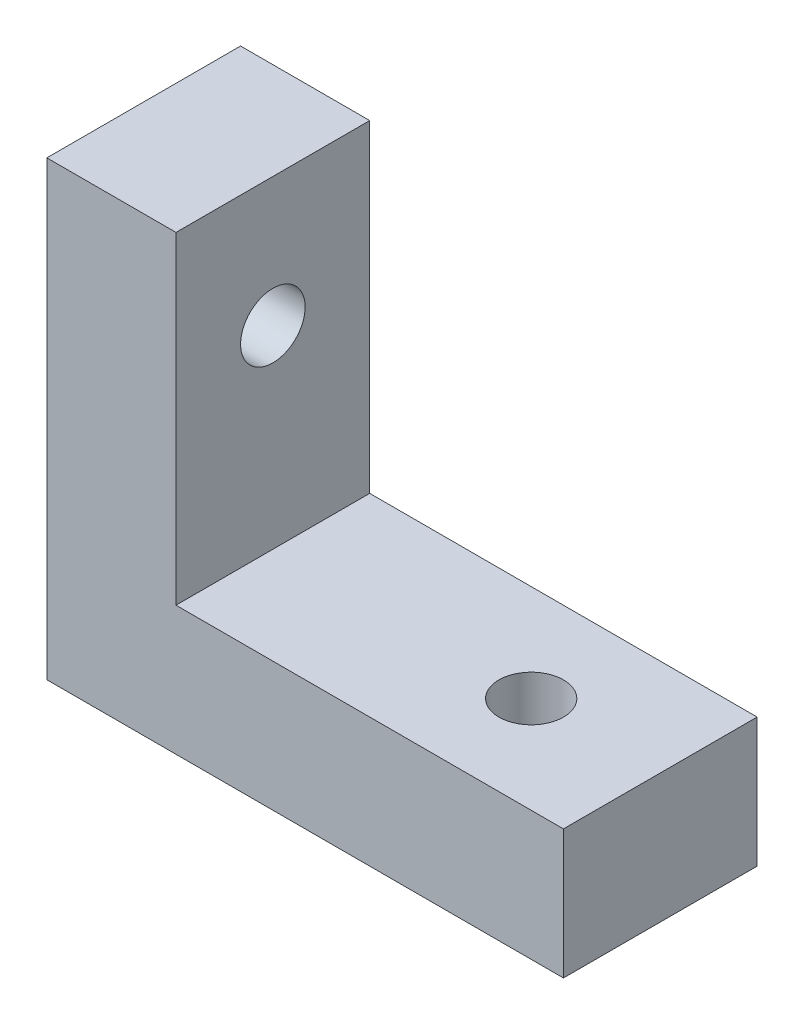
ISO-10303-21;
HEADER;
FILE_DESCRIPTION(('STEP AP214'),'2;1');
FILE_NAME('part.step','',(''),(''),'','','');
FILE_SCHEMA(('AUTOMOTIVE_DESIGN { 1 0 10303 214 1 1 1 1 }'));
ENDSEC;
DATA;
#1=APPLICATION_CONTEXT('core data for automotive mechanical design processes');
#2=APPLICATION_PROTOCOL_DEFINITION('international standard','automotive_design',2000,#1);
#3=PRODUCT_CONTEXT('',#1,'mechanical');
#4=PRODUCT('Part','Part','',(#3));
#5=PRODUCT_RELATED_PRODUCT_CATEGORY('part','',(#4));
#6=PRODUCT_DEFINITION_FORMATION('','',#4);
#7=PRODUCT_DEFINITION_CONTEXT('part definition',#1,'design');
#8=PRODUCT_DEFINITION('design','',#6,#7);
#9=PRODUCT_DEFINITION_SHAPE('','',#8);
#10=(LENGTH_UNIT() NAMED_UNIT(*) SI_UNIT(.MILLI.,.METRE.));
#11=(NAMED_UNIT(*) PLANE_ANGLE_UNIT() SI_UNIT($,.RADIAN.));
#12=(NAMED_UNIT(*) SI_UNIT($,.STERADIAN.) SOLID_ANGLE_UNIT());
#13=UNCERTAINTY_MEASURE_WITH_UNIT(LENGTH_MEASURE(1.E-05),#10,'distance_accuracy_value','');
#14=(GEOMETRIC_REPRESENTATION_CONTEXT(3) GLOBAL_UNCERTAINTY_ASSIGNED_CONTEXT((#13)) GLOBAL_UNIT_ASSIGNED_CONTEXT((#10,
#11,#12)) REPRESENTATION_CONTEXT('',''));
#15=CARTESIAN_POINT('',(0.,0.,0.));
#16=DIRECTION('',(0.,0.,1.));
#17=DIRECTION('',(1.,0.,0.));
#18=AXIS2_PLACEMENT_3D('',#15,#16,#17);
#19=CARTESIAN_POINT('',(0.,20.,0.));
#20=DIRECTION('',(0.,1.,0.));
#21=DIRECTION('',(0.,0.,1.));
#22=AXIS2_PLACEMENT_3D('',#19,#20,#21);
#23=PLANE('',#22);
#24=CARTESIAN_POINT('',(60.0181822973605,20.,-14.9932073778095));
#25=DIRECTION('',(0.,1.,0.));
#26=DIRECTION('',(0.,0.,1.));
#27=AXIS2_PLACEMENT_3D('',#24,#25,#26);
#28=CIRCLE('',#27,5.);
#29=CARTESIAN_POINT('',(60.0181822973605,20.,-9.9932073778095));
#30=VERTEX_POINT('',#29);
#31=EDGE_CURVE('E249',#30,#30,#28,.T.);
#32=ORIENTED_EDGE('',*,*,#31,.F.);
#33=EDGE_LOOP('',(#32));
#34=FACE_BOUND('',#33,.T.);
#35=DIRECTION('',(-1.,0.,0.));
#36=VECTOR('',#35,1.);
#37=CARTESIAN_POINT('',(80.,20.,-30.));
#38=LINE('',#37,#36);
#39=CARTESIAN_POINT('',(80.,20.,-30.));
#40=VERTEX_POINT('',#39);
#41=CARTESIAN_POINT('',(20.,20.,-30.));
#42=VERTEX_POINT('',#41);
#43=EDGE_CURVE('E109',#40,#42,#38,.T.);
#44=ORIENTED_EDGE('',*,*,#43,.T.);
#45=DIRECTION('',(0.,0.,1.));
#46=VECTOR('',#45,1.);
#47=CARTESIAN_POINT('',(20.,20.,-30.));
#48=LINE('',#47,#46);
#49=CARTESIAN_POINT('',(20.,20.,0.));
#50=VERTEX_POINT('',#49);
#51=EDGE_CURVE('E154',#42,#50,#48,.T.);
#52=ORIENTED_EDGE('',*,*,#51,.T.);
#53=DIRECTION('',(1.,0.,0.));
#54=VECTOR('',#53,1.);
#55=CARTESIAN_POINT('',(0.,20.,0.));
#56=LINE('',#55,#54);
#57=CARTESIAN_POINT('',(80.,20.,0.));
#58=VERTEX_POINT('',#57);
#59=EDGE_CURVE('E98',#50,#58,#56,.T.);
#60=ORIENTED_EDGE('',*,*,#59,.T.);
#61=DIRECTION('',(0.,0.,-1.));
#62=VECTOR('',#61,1.);
#63=CARTESIAN_POINT('',(80.,20.,0.));
#64=LINE('',#63,#62);
#65=EDGE_CURVE('E65',#58,#40,#64,.T.);
#66=ORIENTED_EDGE('',*,*,#65,.T.);
#67=EDGE_LOOP('',(#44,#52,#60,#66));
#68=FACE_BOUND('',#67,.T.);
#69=ADVANCED_FACE('F39',(#34,#68),#23,.T.);
#70=CARTESIAN_POINT('',(0.,20.,-30.));
#71=DIRECTION('',(1.,0.,0.));
#72=DIRECTION('',(0.,0.,-1.));
#73=AXIS2_PLACEMENT_3D('',#70,#71,#72);
#74=PLANE('',#73);
#75=CARTESIAN_POINT('',(0.,50.,-15.));
#76=DIRECTION('',(1.,0.,0.));
#77=DIRECTION('',(0.,0.,-1.));
#78=AXIS2_PLACEMENT_3D('',#75,#76,#77);
#79=CIRCLE('',#78,5.);
#80=CARTESIAN_POINT('',(0.,50.,-20.));
#81=VERTEX_POINT('',#80);
#82=EDGE_CURVE('E247',#81,#81,#79,.T.);
#83=ORIENTED_EDGE('',*,*,#82,.T.);
#84=EDGE_LOOP('',(#83));
#85=FACE_BOUND('',#84,.T.);
#86=DIRECTION('',(0.,0.,1.));
#87=VECTOR('',#86,1.);
#88=CARTESIAN_POINT('',(0.,0.,-30.));
#89=LINE('',#88,#87);
#90=CARTESIAN_POINT('',(0.,0.,-30.));
#91=VERTEX_POINT('',#90);
#92=CARTESIAN_POINT('',(0.,0.,0.));
#93=VERTEX_POINT('',#92);
#94=EDGE_CURVE('E104',#91,#93,#89,.T.);
#95=ORIENTED_EDGE('',*,*,#94,.T.);
#96=DIRECTION('',(0.,-1.,0.));
#97=VECTOR('',#96,1.);
#98=CARTESIAN_POINT('',(0.,20.,0.));
#99=LINE('',#98,#97);
#100=CARTESIAN_POINT('',(0.,70.,0.));
#101=VERTEX_POINT('',#100);
#102=EDGE_CURVE('E11',#101,#93,#99,.T.);
#103=ORIENTED_EDGE('',*,*,#102,.F.);
#104=DIRECTION('',(0.,0.,1.));
#105=VECTOR('',#104,1.);
#106=CARTESIAN_POINT('',(0.,70.,-30.));
#107=LINE('',#106,#105);
#108=CARTESIAN_POINT('',(0.,70.,-30.));
#109=VERTEX_POINT('',#108);
#110=EDGE_CURVE('E106',#109,#101,#107,.T.);
#111=ORIENTED_EDGE('',*,*,#110,.F.);
#112=DIRECTION('',(0.,-1.,0.));
#113=VECTOR('',#112,1.);
#114=CARTESIAN_POINT('',(0.,20.,-30.));
#115=LINE('',#114,#113);
#116=EDGE_CURVE('E90',#109,#91,#115,.T.);
#117=ORIENTED_EDGE('',*,*,#116,.T.);
#118=EDGE_LOOP('',(#95,#103,#111,#117));
#119=FACE_BOUND('',#118,.T.);
#120=ADVANCED_FACE('F41',(#85,#119),#74,.F.);
#121=CARTESIAN_POINT('',(0.,20.,0.));
#122=DIRECTION('',(0.,0.,-1.));
#123=DIRECTION('',(-1.,0.,0.));
#124=AXIS2_PLACEMENT_3D('',#121,#122,#123);
#125=PLANE('',#124);
#126=DIRECTION('',(1.,0.,0.));
#127=VECTOR('',#126,1.);
#128=CARTESIAN_POINT('',(0.,0.,0.));
#129=LINE('',#128,#127);
#130=CARTESIAN_POINT('',(80.,0.,0.));
#131=VERTEX_POINT('',#130);
#132=EDGE_CURVE('E112',#93,#131,#129,.T.);
#133=ORIENTED_EDGE('',*,*,#132,.T.);
#134=DIRECTION('',(0.,-1.,0.));
#135=VECTOR('',#134,1.);
#136=CARTESIAN_POINT('',(80.,20.,0.));
#137=LINE('',#136,#135);
#138=EDGE_CURVE('E49',#58,#131,#137,.T.);
#139=ORIENTED_EDGE('',*,*,#138,.F.);
#140=ORIENTED_EDGE('',*,*,#59,.F.);
#141=DIRECTION('',(0.,-1.,0.));
#142=VECTOR('',#141,1.);
#143=CARTESIAN_POINT('',(20.,70.,0.));
#144=LINE('',#143,#142);
#145=CARTESIAN_POINT('',(20.,70.,0.));
#146=VERTEX_POINT('',#145);
#147=EDGE_CURVE('E56',#146,#50,#144,.T.);
#148=ORIENTED_EDGE('',*,*,#147,.F.);
#149=DIRECTION('',(1.,0.,0.));
#150=VECTOR('',#149,1.);
#151=CARTESIAN_POINT('',(0.,70.,0.));
#152=LINE('',#151,#150);
#153=EDGE_CURVE('E137',#101,#146,#152,.T.);
#154=ORIENTED_EDGE('',*,*,#153,.F.);
#155=ORIENTED_EDGE('',*,*,#102,.T.);
#156=EDGE_LOOP('',(#133,#139,#140,#148,#154,#155));
#157=FACE_BOUND('',#156,.T.);
#158=ADVANCED_FACE('F134',(#157),#125,.F.);
#159=CARTESIAN_POINT('',(80.,20.,0.));
#160=DIRECTION('',(-1.,0.,0.));
#161=DIRECTION('',(0.,0.,1.));
#162=AXIS2_PLACEMENT_3D('',#159,#160,#161);
#163=PLANE('',#162);
#164=DIRECTION('',(0.,0.,-1.));
#165=VECTOR('',#164,1.);
#166=CARTESIAN_POINT('',(80.,0.,0.));
#167=LINE('',#166,#165);
#168=CARTESIAN_POINT('',(80.,0.,-30.));
#169=VERTEX_POINT('',#168);
#170=EDGE_CURVE('E99',#131,#169,#167,.T.);
#171=ORIENTED_EDGE('',*,*,#170,.T.);
#172=DIRECTION('',(0.,-1.,0.));
#173=VECTOR('',#172,1.);
#174=CARTESIAN_POINT('',(80.,20.,-30.));
#175=LINE('',#174,#173);
#176=EDGE_CURVE('E93',#40,#169,#175,.T.);
#177=ORIENTED_EDGE('',*,*,#176,.F.);
#178=ORIENTED_EDGE('',*,*,#65,.F.);
#179=ORIENTED_EDGE('',*,*,#138,.T.);
#180=EDGE_LOOP('',(#171,#177,#178,#179));
#181=FACE_BOUND('',#180,.T.);
#182=ADVANCED_FACE('F131',(#181),#163,.F.);
#183=CARTESIAN_POINT('',(80.,20.,-30.));
#184=DIRECTION('',(0.,0.,1.));
#185=DIRECTION('',(1.,0.,0.));
#186=AXIS2_PLACEMENT_3D('',#183,#184,#185);
#187=PLANE('',#186);
#188=DIRECTION('',(-1.,0.,0.));
#189=VECTOR('',#188,1.);
#190=CARTESIAN_POINT('',(80.,0.,-30.));
#191=LINE('',#190,#189);
#192=EDGE_CURVE('E85',#169,#91,#191,.T.);
#193=ORIENTED_EDGE('',*,*,#192,.T.);
#194=ORIENTED_EDGE('',*,*,#116,.F.);
#195=DIRECTION('',(1.,0.,0.));
#196=VECTOR('',#195,1.);
#197=CARTESIAN_POINT('',(0.,70.,-30.));
#198=LINE('',#197,#196);
#199=CARTESIAN_POINT('',(20.,70.,-30.));
#200=VERTEX_POINT('',#199);
#201=EDGE_CURVE('E143',#109,#200,#198,.T.);
#202=ORIENTED_EDGE('',*,*,#201,.T.);
#203=DIRECTION('',(0.,-1.,0.));
#204=VECTOR('',#203,1.);
#205=CARTESIAN_POINT('',(20.,70.,-30.));
#206=LINE('',#205,#204);
#207=EDGE_CURVE('E118',#200,#42,#206,.T.);
#208=ORIENTED_EDGE('',*,*,#207,.T.);
#209=ORIENTED_EDGE('',*,*,#43,.F.);
#210=ORIENTED_EDGE('',*,*,#176,.T.);
#211=EDGE_LOOP('',(#193,#194,#202,#208,#209,#210));
#212=FACE_BOUND('',#211,.T.);
#213=ADVANCED_FACE('F87',(#212),#187,.F.);
#214=CARTESIAN_POINT('',(0.,0.,0.));
#215=DIRECTION('',(0.,1.,0.));
#216=DIRECTION('',(0.,0.,1.));
#217=AXIS2_PLACEMENT_3D('',#214,#215,#216);
#218=PLANE('',#217);
#219=CARTESIAN_POINT('',(60.0181822973605,0.,-14.9932073778095));
#220=DIRECTION('',(0.,1.,0.));
#221=DIRECTION('',(0.,0.,1.));
#222=AXIS2_PLACEMENT_3D('',#219,#220,#221);
#223=CIRCLE('',#222,5.);
#224=CARTESIAN_POINT('',(60.0181822973605,0.,-9.9932073778095));
#225=VERTEX_POINT('',#224);
#226=EDGE_CURVE('E43',#225,#225,#223,.T.);
#227=ORIENTED_EDGE('',*,*,#226,.T.);
#228=EDGE_LOOP('',(#227));
#229=FACE_BOUND('',#228,.T.);
#230=ORIENTED_EDGE('',*,*,#94,.F.);
#231=ORIENTED_EDGE('',*,*,#192,.F.);
#232=ORIENTED_EDGE('',*,*,#170,.F.);
#233=ORIENTED_EDGE('',*,*,#132,.F.);
#234=EDGE_LOOP('',(#230,#231,#232,#233));
#235=FACE_BOUND('',#234,.T.);
#236=ADVANCED_FACE('F111',(#229,#235),#218,.F.);
#237=CARTESIAN_POINT('',(20.,70.,-30.));
#238=DIRECTION('',(1.,0.,0.));
#239=DIRECTION('',(0.,0.,-1.));
#240=AXIS2_PLACEMENT_3D('',#237,#238,#239);
#241=PLANE('',#240);
#242=CARTESIAN_POINT('',(20.,50.,-15.));
#243=DIRECTION('',(1.,0.,0.));
#244=DIRECTION('',(0.,0.,-1.));
#245=AXIS2_PLACEMENT_3D('',#242,#243,#244);
#246=CIRCLE('',#245,5.);
#247=CARTESIAN_POINT('',(20.,50.,-20.));
#248=VERTEX_POINT('',#247);
#249=EDGE_CURVE('E244',#248,#248,#246,.T.);
#250=ORIENTED_EDGE('',*,*,#249,.F.);
#251=EDGE_LOOP('',(#250));
#252=FACE_BOUND('',#251,.T.);
#253=ORIENTED_EDGE('',*,*,#51,.F.);
#254=ORIENTED_EDGE('',*,*,#207,.F.);
#255=DIRECTION('',(0.,0.,1.));
#256=VECTOR('',#255,1.);
#257=CARTESIAN_POINT('',(20.,70.,-30.));
#258=LINE('',#257,#256);
#259=EDGE_CURVE('E150',#200,#146,#258,.T.);
#260=ORIENTED_EDGE('',*,*,#259,.T.);
#261=ORIENTED_EDGE('',*,*,#147,.T.);
#262=EDGE_LOOP('',(#253,#254,#260,#261));
#263=FACE_BOUND('',#262,.T.);
#264=ADVANCED_FACE('F163',(#252,#263),#241,.T.);
#265=CARTESIAN_POINT('',(0.,70.,0.));
#266=DIRECTION('',(0.,-1.,0.));
#267=DIRECTION('',(0.,0.,-1.));
#268=AXIS2_PLACEMENT_3D('',#265,#266,#267);
#269=PLANE('',#268);
#270=ORIENTED_EDGE('',*,*,#153,.T.);
#271=ORIENTED_EDGE('',*,*,#259,.F.);
#272=ORIENTED_EDGE('',*,*,#201,.F.);
#273=ORIENTED_EDGE('',*,*,#110,.T.);
#274=EDGE_LOOP('',(#270,#271,#272,#273));
#275=FACE_BOUND('',#274,.T.);
#276=ADVANCED_FACE('F140',(#275),#269,.F.);
#277=CARTESIAN_POINT('',(60.0181822973605,-30.,-14.9932073778095));
#278=DIRECTION('',(0.,1.,0.));
#279=DIRECTION('',(0.,0.,1.));
#280=AXIS2_PLACEMENT_3D('',#277,#278,#279);
#281=CYLINDRICAL_SURFACE('',#280,5.);
#282=ORIENTED_EDGE('',*,*,#31,.T.);
#283=EDGE_LOOP('',(#282));
#284=FACE_BOUND('',#283,.T.);
#285=ORIENTED_EDGE('',*,*,#226,.F.);
#286=EDGE_LOOP('',(#285));
#287=FACE_BOUND('',#286,.T.);
#288=ADVANCED_FACE('F171',(#284,#287),#281,.F.);
#289=CARTESIAN_POINT('',(-30.,50.,-15.));
#290=DIRECTION('',(1.,0.,0.));
#291=DIRECTION('',(0.,0.,-1.));
#292=AXIS2_PLACEMENT_3D('',#289,#290,#291);
#293=CYLINDRICAL_SURFACE('',#292,5.);
#294=ORIENTED_EDGE('',*,*,#249,.T.);
#295=EDGE_LOOP('',(#294));
#296=FACE_BOUND('',#295,.T.);
#297=ORIENTED_EDGE('',*,*,#82,.F.);
#298=EDGE_LOOP('',(#297));
#299=FACE_BOUND('',#298,.T.);
#300=ADVANCED_FACE('F217',(#296,#299),#293,.F.);
#301=CLOSED_SHELL('',(#69,#120,#158,#182,#213,#236,#264,#276,#288,#300));
#302=MANIFOLD_SOLID_BREP('B2',#301);
#303=ADVANCED_BREP_SHAPE_REPRESENTATION('',(#18,#302),#14);
#304=SHAPE_DEFINITION_REPRESENTATION(#9,#303);
ENDSEC;
END-ISO-10303-21;
